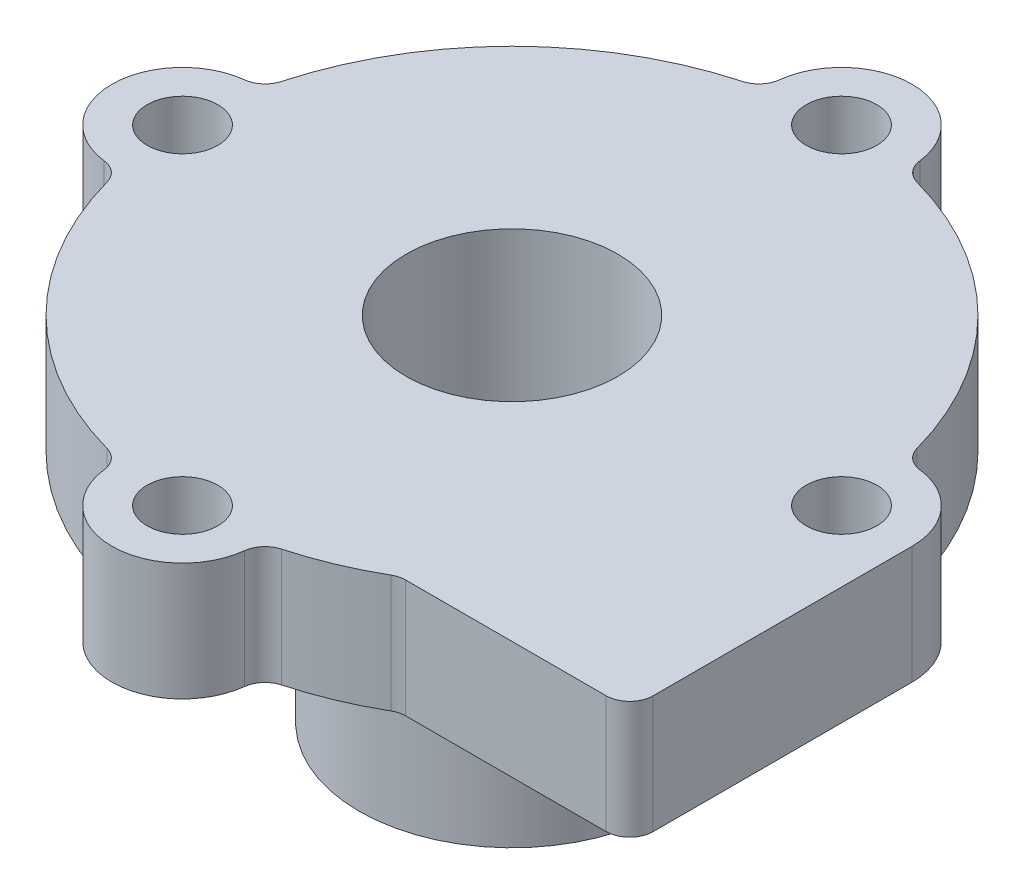
ISO-10303-21;
HEADER;
FILE_DESCRIPTION(('STEP AP214'),'2;1');
FILE_NAME('part.step','',(''),(''),'','','');
FILE_SCHEMA(('AUTOMOTIVE_DESIGN { 1 0 10303 214 1 1 1 1 }'));
ENDSEC;
DATA;
#1=APPLICATION_CONTEXT('core data for automotive mechanical design processes');
#2=APPLICATION_PROTOCOL_DEFINITION('international standard','automotive_design',2000,#1);
#3=PRODUCT_CONTEXT('',#1,'mechanical');
#4=PRODUCT('Part','Part','',(#3));
#5=PRODUCT_RELATED_PRODUCT_CATEGORY('part','',(#4));
#6=PRODUCT_DEFINITION_FORMATION('','',#4);
#7=PRODUCT_DEFINITION_CONTEXT('part definition',#1,'design');
#8=PRODUCT_DEFINITION('design','',#6,#7);
#9=PRODUCT_DEFINITION_SHAPE('','',#8);
#10=(LENGTH_UNIT() NAMED_UNIT(*) SI_UNIT(.MILLI.,.METRE.));
#11=(NAMED_UNIT(*) PLANE_ANGLE_UNIT() SI_UNIT($,.RADIAN.));
#12=(NAMED_UNIT(*) SI_UNIT($,.STERADIAN.) SOLID_ANGLE_UNIT());
#13=UNCERTAINTY_MEASURE_WITH_UNIT(LENGTH_MEASURE(1.E-05),#10,'distance_accuracy_value','');
#14=(GEOMETRIC_REPRESENTATION_CONTEXT(3) GLOBAL_UNCERTAINTY_ASSIGNED_CONTEXT((#13)) GLOBAL_UNIT_ASSIGNED_CONTEXT((#10,
#11,#12)) REPRESENTATION_CONTEXT('',''));
#15=CARTESIAN_POINT('',(0.,0.,0.));
#16=DIRECTION('',(0.,0.,1.));
#17=DIRECTION('',(1.,0.,0.));
#18=AXIS2_PLACEMENT_3D('',#15,#16,#17);
#19=CARTESIAN_POINT('',(0.,0.,0.));
#20=DIRECTION('',(0.,1.,0.));
#21=DIRECTION('',(0.,0.,1.));
#22=AXIS2_PLACEMENT_3D('',#19,#20,#21);
#23=PLANE('',#22);
#24=CARTESIAN_POINT('',(0.,0.,0.));
#25=DIRECTION('',(0.,1.,0.));
#26=DIRECTION('',(0.,0.,1.));
#27=AXIS2_PLACEMENT_3D('',#24,#25,#26);
#28=CIRCLE('',#27,7.5);
#29=CARTESIAN_POINT('',(0.,0.,7.5));
#30=VERTEX_POINT('',#29);
#31=EDGE_CURVE('E233',#30,#30,#28,.T.);
#32=ORIENTED_EDGE('',*,*,#31,.T.);
#33=EDGE_LOOP('',(#32));
#34=FACE_BOUND('',#33,.T.);
#35=CARTESIAN_POINT('',(0.,0.,-14.));
#36=DIRECTION('',(0.,1.,0.));
#37=DIRECTION('',(0.,0.,1.));
#38=AXIS2_PLACEMENT_3D('',#35,#36,#37);
#39=CIRCLE('',#38,1.5);
#40=CARTESIAN_POINT('',(0.,0.,-12.5));
#41=VERTEX_POINT('',#40);
#42=EDGE_CURVE('E203',#41,#41,#39,.T.);
#43=ORIENTED_EDGE('',*,*,#42,.T.);
#44=EDGE_LOOP('',(#43));
#45=FACE_BOUND('',#44,.T.);
#46=DIRECTION('',(0.,0.,-1.));
#47=VECTOR('',#46,1.);
#48=CARTESIAN_POINT('',(17.,0.,12.));
#49=LINE('',#48,#47);
#50=CARTESIAN_POINT('',(17.,0.,11.));
#51=VERTEX_POINT('',#50);
#52=CARTESIAN_POINT('',(17.,0.,0.));
#53=VERTEX_POINT('',#52);
#54=EDGE_CURVE('E163',#51,#53,#49,.T.);
#55=ORIENTED_EDGE('',*,*,#54,.F.);
#56=CARTESIAN_POINT('',(16.,0.,11.));
#57=DIRECTION('',(0.,1.,0.));
#58=DIRECTION('',(0.,0.,1.));
#59=AXIS2_PLACEMENT_3D('',#56,#57,#58);
#60=CIRCLE('',#59,1.);
#61=CARTESIAN_POINT('',(16.,0.,12.));
#62=VERTEX_POINT('',#61);
#63=EDGE_CURVE('E230',#51,#62,#60,.F.);
#64=ORIENTED_EDGE('',*,*,#63,.T.);
#65=DIRECTION('',(1.,0.,0.));
#66=VECTOR('',#65,1.);
#67=CARTESIAN_POINT('',(0.,0.,12.));
#68=LINE('',#67,#66);
#69=CARTESIAN_POINT('',(7.48331477354788,0.,12.));
#70=VERTEX_POINT('',#69);
#71=EDGE_CURVE('E172',#70,#62,#68,.T.);
#72=ORIENTED_EDGE('',*,*,#71,.F.);
#73=CARTESIAN_POINT('',(7.48331477354788,0.,13.));
#74=DIRECTION('',(0.,1.,0.));
#75=DIRECTION('',(0.,0.,1.));
#76=AXIS2_PLACEMENT_3D('',#73,#74,#75);
#77=CIRCLE('',#76,1.);
#78=CARTESIAN_POINT('',(6.98442712197802,0.,12.1333333333333));
#79=VERTEX_POINT('',#78);
#80=EDGE_CURVE('E11',#70,#79,#77,.T.);
#81=ORIENTED_EDGE('',*,*,#80,.T.);
#82=CARTESIAN_POINT('',(0.,0.,0.));
#83=DIRECTION('',(0.,1.,0.));
#84=DIRECTION('',(0.,0.,1.));
#85=AXIS2_PLACEMENT_3D('',#82,#83,#84);
#86=CIRCLE('',#85,14.);
#87=CARTESIAN_POINT('',(3.70809924354783,0.,13.5));
#88=VERTEX_POINT('',#87);
#89=EDGE_CURVE('E225',#88,#79,#86,.T.);
#90=ORIENTED_EDGE('',*,*,#89,.F.);
#91=CARTESIAN_POINT('',(3.97296347522982,0.,14.4642857142857));
#92=DIRECTION('',(0.,1.,0.));
#93=DIRECTION('',(0.,0.,1.));
#94=AXIS2_PLACEMENT_3D('',#91,#92,#93);
#95=CIRCLE('',#94,1.);
#96=CARTESIAN_POINT('',(2.97972260642237,0.,14.3482142857143));
#97=VERTEX_POINT('',#96);
#98=EDGE_CURVE('E304',#88,#97,#95,.T.);
#99=ORIENTED_EDGE('',*,*,#98,.T.);
#100=CARTESIAN_POINT('',(0.,0.,14.));
#101=DIRECTION('',(0.,1.,0.));
#102=DIRECTION('',(0.,0.,-1.));
#103=AXIS2_PLACEMENT_3D('',#100,#101,#102);
#104=CIRCLE('',#103,3.);
#105=CARTESIAN_POINT('',(-2.97972260642237,0.,14.3482142857143));
#106=VERTEX_POINT('',#105);
#107=EDGE_CURVE('E188',#106,#97,#104,.T.);
#108=ORIENTED_EDGE('',*,*,#107,.F.);
#109=CARTESIAN_POINT('',(-3.97296347522982,0.,14.4642857142857));
#110=DIRECTION('',(0.,1.,0.));
#111=DIRECTION('',(0.,0.,1.));
#112=AXIS2_PLACEMENT_3D('',#109,#110,#111);
#113=CIRCLE('',#112,1.);
#114=CARTESIAN_POINT('',(-3.70809924354783,0.,13.5));
#115=VERTEX_POINT('',#114);
#116=EDGE_CURVE('E298',#106,#115,#113,.T.);
#117=ORIENTED_EDGE('',*,*,#116,.T.);
#118=CARTESIAN_POINT('',(-13.5,0.,3.70809924354788));
#119=VERTEX_POINT('',#118);
#120=EDGE_CURVE('E328',#119,#115,#86,.T.);
#121=ORIENTED_EDGE('',*,*,#120,.F.);
#122=CARTESIAN_POINT('',(-14.4642857142857,0.,3.97296347522987));
#123=DIRECTION('',(0.,1.,0.));
#124=DIRECTION('',(0.,0.,1.));
#125=AXIS2_PLACEMENT_3D('',#122,#123,#124);
#126=CIRCLE('',#125,1.);
#127=CARTESIAN_POINT('',(-14.3482142857143,0.,2.97972260642242));
#128=VERTEX_POINT('',#127);
#129=EDGE_CURVE('E296',#119,#128,#126,.T.);
#130=ORIENTED_EDGE('',*,*,#129,.T.);
#131=CARTESIAN_POINT('',(-14.,0.,0.));
#132=DIRECTION('',(0.,1.,0.));
#133=DIRECTION('',(1.,0.,0.));
#134=AXIS2_PLACEMENT_3D('',#131,#132,#133);
#135=CIRCLE('',#134,3.);
#136=CARTESIAN_POINT('',(-14.3482142857143,0.,-2.97972260642231));
#137=VERTEX_POINT('',#136);
#138=EDGE_CURVE('E194',#137,#128,#135,.T.);
#139=ORIENTED_EDGE('',*,*,#138,.F.);
#140=CARTESIAN_POINT('',(-14.4642857142857,0.,-3.97296347522977));
#141=DIRECTION('',(0.,1.,0.));
#142=DIRECTION('',(0.,0.,1.));
#143=AXIS2_PLACEMENT_3D('',#140,#141,#142);
#144=CIRCLE('',#143,1.);
#145=CARTESIAN_POINT('',(-13.5,0.,-3.70809924354778));
#146=VERTEX_POINT('',#145);
#147=EDGE_CURVE('E290',#137,#146,#144,.T.);
#148=ORIENTED_EDGE('',*,*,#147,.T.);
#149=CARTESIAN_POINT('',(-3.70809924354783,0.,-13.5));
#150=VERTEX_POINT('',#149);
#151=EDGE_CURVE('E226',#150,#146,#86,.T.);
#152=ORIENTED_EDGE('',*,*,#151,.F.);
#153=CARTESIAN_POINT('',(-3.97296347522982,0.,-14.4642857142857));
#154=DIRECTION('',(0.,1.,0.));
#155=DIRECTION('',(0.,0.,1.));
#156=AXIS2_PLACEMENT_3D('',#153,#154,#155);
#157=CIRCLE('',#156,1.);
#158=CARTESIAN_POINT('',(-2.97972260642237,0.,-14.3482142857143));
#159=VERTEX_POINT('',#158);
#160=EDGE_CURVE('E288',#150,#159,#157,.T.);
#161=ORIENTED_EDGE('',*,*,#160,.T.);
#162=CARTESIAN_POINT('',(0.,0.,-14.));
#163=DIRECTION('',(0.,1.,0.));
#164=DIRECTION('',(0.,0.,1.));
#165=AXIS2_PLACEMENT_3D('',#162,#163,#164);
#166=CIRCLE('',#165,3.);
#167=CARTESIAN_POINT('',(2.97972260642237,0.,-14.3482142857143));
#168=VERTEX_POINT('',#167);
#169=EDGE_CURVE('E206',#168,#159,#166,.T.);
#170=ORIENTED_EDGE('',*,*,#169,.F.);
#171=CARTESIAN_POINT('',(3.97296347522982,0.,-14.4642857142857));
#172=DIRECTION('',(0.,1.,0.));
#173=DIRECTION('',(0.,0.,1.));
#174=AXIS2_PLACEMENT_3D('',#171,#172,#173);
#175=CIRCLE('',#174,1.);
#176=CARTESIAN_POINT('',(3.70809924354783,0.,-13.5));
#177=VERTEX_POINT('',#176);
#178=EDGE_CURVE('E282',#168,#177,#175,.T.);
#179=ORIENTED_EDGE('',*,*,#178,.T.);
#180=CARTESIAN_POINT('',(13.5,0.,-3.70809924354797));
#181=VERTEX_POINT('',#180);
#182=EDGE_CURVE('E217',#181,#177,#86,.T.);
#183=ORIENTED_EDGE('',*,*,#182,.F.);
#184=CARTESIAN_POINT('',(14.4642857142857,0.,-3.97296347522997));
#185=DIRECTION('',(0.,1.,0.));
#186=DIRECTION('',(0.,0.,1.));
#187=AXIS2_PLACEMENT_3D('',#184,#185,#186);
#188=CIRCLE('',#187,1.);
#189=CARTESIAN_POINT('',(14.3482142857143,0.,-2.97972260642252));
#190=VERTEX_POINT('',#189);
#191=EDGE_CURVE('E186',#181,#190,#188,.T.);
#192=ORIENTED_EDGE('',*,*,#191,.T.);
#193=CARTESIAN_POINT('',(14.,0.,-1.46642216231412E-13));
#194=DIRECTION('',(0.,1.,0.));
#195=DIRECTION('',(-1.,0.,0.));
#196=AXIS2_PLACEMENT_3D('',#193,#194,#195);
#197=CIRCLE('',#196,3.);
#198=EDGE_CURVE('E178',#53,#190,#197,.T.);
#199=ORIENTED_EDGE('',*,*,#198,.F.);
#200=EDGE_LOOP('',(#55,#64,#72,#81,#90,#99,#108,#117,#121,#130,#139,#148,#152,#161,#170,#179,
#183,#192,#199));
#201=FACE_BOUND('',#200,.T.);
#202=CARTESIAN_POINT('',(-14.,0.,0.));
#203=DIRECTION('',(0.,1.,0.));
#204=DIRECTION('',(1.,0.,0.));
#205=AXIS2_PLACEMENT_3D('',#202,#203,#204);
#206=CIRCLE('',#205,1.5);
#207=CARTESIAN_POINT('',(-12.5,0.,0.));
#208=VERTEX_POINT('',#207);
#209=EDGE_CURVE('E318',#208,#208,#206,.T.);
#210=ORIENTED_EDGE('',*,*,#209,.T.);
#211=EDGE_LOOP('',(#210));
#212=FACE_BOUND('',#211,.T.);
#213=CARTESIAN_POINT('',(0.,0.,14.));
#214=DIRECTION('',(0.,1.,0.));
#215=DIRECTION('',(0.,0.,-1.));
#216=AXIS2_PLACEMENT_3D('',#213,#214,#215);
#217=CIRCLE('',#216,1.5);
#218=CARTESIAN_POINT('',(0.,0.,12.5));
#219=VERTEX_POINT('',#218);
#220=EDGE_CURVE('E429',#219,#219,#217,.T.);
#221=ORIENTED_EDGE('',*,*,#220,.T.);
#222=EDGE_LOOP('',(#221));
#223=FACE_BOUND('',#222,.T.);
#224=CARTESIAN_POINT('',(14.,0.,-1.46642216231412E-13));
#225=DIRECTION('',(0.,1.,0.));
#226=DIRECTION('',(-1.,0.,0.));
#227=AXIS2_PLACEMENT_3D('',#224,#225,#226);
#228=CIRCLE('',#227,1.5);
#229=CARTESIAN_POINT('',(12.5,0.,-1.30930550206618E-13));
#230=VERTEX_POINT('',#229);
#231=EDGE_CURVE('E435',#230,#230,#228,.T.);
#232=ORIENTED_EDGE('',*,*,#231,.T.);
#233=EDGE_LOOP('',(#232));
#234=FACE_BOUND('',#233,.T.);
#235=ADVANCED_FACE('F33',(#34,#45,#201,#212,#223,#234),#23,.F.);
#236=CARTESIAN_POINT('',(0.,5.,0.));
#237=DIRECTION('',(0.,-1.,0.));
#238=DIRECTION('',(0.,0.,-1.));
#239=AXIS2_PLACEMENT_3D('',#236,#237,#238);
#240=CYLINDRICAL_SURFACE('',#239,14.);
#241=CARTESIAN_POINT('',(0.,5.,0.));
#242=DIRECTION('',(0.,1.,0.));
#243=DIRECTION('',(0.,0.,1.));
#244=AXIS2_PLACEMENT_3D('',#241,#242,#243);
#245=CIRCLE('',#244,14.);
#246=CARTESIAN_POINT('',(3.70809924354783,5.,13.5));
#247=VERTEX_POINT('',#246);
#248=CARTESIAN_POINT('',(6.98442712197802,5.,12.1333333333333));
#249=VERTEX_POINT('',#248);
#250=EDGE_CURVE('E218',#247,#249,#245,.T.);
#251=ORIENTED_EDGE('',*,*,#250,.F.);
#252=DIRECTION('',(0.,-1.,0.));
#253=VECTOR('',#252,1.);
#254=CARTESIAN_POINT('',(3.70809924354783,5.,13.5));
#255=LINE('',#254,#253);
#256=EDGE_CURVE('E271',#247,#88,#255,.T.);
#257=ORIENTED_EDGE('',*,*,#256,.T.);
#258=ORIENTED_EDGE('',*,*,#89,.T.);
#259=DIRECTION('',(0.,-1.,0.));
#260=VECTOR('',#259,1.);
#261=CARTESIAN_POINT('',(6.98442712197802,5.,12.1333333333333));
#262=LINE('',#261,#260);
#263=EDGE_CURVE('E268',#79,#249,#262,.F.);
#264=ORIENTED_EDGE('',*,*,#263,.T.);
#265=EDGE_LOOP('',(#251,#257,#258,#264));
#266=FACE_BOUND('',#265,.T.);
#267=ADVANCED_FACE('F326',(#266),#240,.T.);
#268=CARTESIAN_POINT('',(13.5,5.,-3.70809924354797));
#269=VERTEX_POINT('',#268);
#270=CARTESIAN_POINT('',(3.70809924354783,5.,-13.5));
#271=VERTEX_POINT('',#270);
#272=EDGE_CURVE('E222',#269,#271,#245,.T.);
#273=ORIENTED_EDGE('',*,*,#272,.F.);
#274=DIRECTION('',(0.,-1.,0.));
#275=VECTOR('',#274,1.);
#276=CARTESIAN_POINT('',(13.5,5.,-3.70809924354797));
#277=LINE('',#276,#275);
#278=EDGE_CURVE('E240',#269,#181,#277,.T.);
#279=ORIENTED_EDGE('',*,*,#278,.T.);
#280=ORIENTED_EDGE('',*,*,#182,.T.);
#281=DIRECTION('',(0.,-1.,0.));
#282=VECTOR('',#281,1.);
#283=CARTESIAN_POINT('',(3.70809924354783,5.,-13.5));
#284=LINE('',#283,#282);
#285=EDGE_CURVE('E238',#177,#271,#284,.F.);
#286=ORIENTED_EDGE('',*,*,#285,.T.);
#287=EDGE_LOOP('',(#273,#279,#280,#286));
#288=FACE_BOUND('',#287,.T.);
#289=ADVANCED_FACE('F371',(#288),#240,.T.);
#290=CARTESIAN_POINT('',(-13.5,5.,3.70809924354788));
#291=VERTEX_POINT('',#290);
#292=CARTESIAN_POINT('',(-3.70809924354783,5.,13.5));
#293=VERTEX_POINT('',#292);
#294=EDGE_CURVE('E221',#291,#293,#245,.T.);
#295=ORIENTED_EDGE('',*,*,#294,.F.);
#296=DIRECTION('',(0.,-1.,0.));
#297=VECTOR('',#296,1.);
#298=CARTESIAN_POINT('',(-13.5,5.,3.70809924354788));
#299=LINE('',#298,#297);
#300=EDGE_CURVE('E260',#291,#119,#299,.T.);
#301=ORIENTED_EDGE('',*,*,#300,.T.);
#302=ORIENTED_EDGE('',*,*,#120,.T.);
#303=DIRECTION('',(0.,-1.,0.));
#304=VECTOR('',#303,1.);
#305=CARTESIAN_POINT('',(-3.70809924354783,5.,13.5));
#306=LINE('',#305,#304);
#307=EDGE_CURVE('E258',#115,#293,#306,.F.);
#308=ORIENTED_EDGE('',*,*,#307,.T.);
#309=EDGE_LOOP('',(#295,#301,#302,#308));
#310=FACE_BOUND('',#309,.T.);
#311=ADVANCED_FACE('F379',(#310),#240,.T.);
#312=CARTESIAN_POINT('',(-3.70809924354783,5.,-13.5));
#313=VERTEX_POINT('',#312);
#314=CARTESIAN_POINT('',(-13.5,5.,-3.70809924354778));
#315=VERTEX_POINT('',#314);
#316=EDGE_CURVE('E231',#313,#315,#245,.T.);
#317=ORIENTED_EDGE('',*,*,#316,.F.);
#318=DIRECTION('',(0.,-1.,0.));
#319=VECTOR('',#318,1.);
#320=CARTESIAN_POINT('',(-3.70809924354783,5.,-13.5));
#321=LINE('',#320,#319);
#322=EDGE_CURVE('E250',#313,#150,#321,.T.);
#323=ORIENTED_EDGE('',*,*,#322,.T.);
#324=ORIENTED_EDGE('',*,*,#151,.T.);
#325=DIRECTION('',(0.,-1.,0.));
#326=VECTOR('',#325,1.);
#327=CARTESIAN_POINT('',(-13.5,5.,-3.70809924354778));
#328=LINE('',#327,#326);
#329=EDGE_CURVE('E248',#146,#315,#328,.F.);
#330=ORIENTED_EDGE('',*,*,#329,.T.);
#331=EDGE_LOOP('',(#317,#323,#324,#330));
#332=FACE_BOUND('',#331,.T.);
#333=ADVANCED_FACE('F373',(#332),#240,.T.);
#334=CARTESIAN_POINT('',(0.,5.,0.));
#335=DIRECTION('',(0.,1.,0.));
#336=DIRECTION('',(0.,0.,1.));
#337=AXIS2_PLACEMENT_3D('',#334,#335,#336);
#338=PLANE('',#337);
#339=CARTESIAN_POINT('',(14.,5.,-1.46642216231412E-13));
#340=DIRECTION('',(0.,1.,0.));
#341=DIRECTION('',(-1.,0.,0.));
#342=AXIS2_PLACEMENT_3D('',#339,#340,#341);
#343=CIRCLE('',#342,1.5);
#344=CARTESIAN_POINT('',(12.5,5.,-1.30930550206618E-13));
#345=VERTEX_POINT('',#344);
#346=EDGE_CURVE('E438',#345,#345,#343,.T.);
#347=ORIENTED_EDGE('',*,*,#346,.F.);
#348=EDGE_LOOP('',(#347));
#349=FACE_BOUND('',#348,.T.);
#350=CARTESIAN_POINT('',(0.,5.,14.));
#351=DIRECTION('',(0.,1.,0.));
#352=DIRECTION('',(0.,0.,-1.));
#353=AXIS2_PLACEMENT_3D('',#350,#351,#352);
#354=CIRCLE('',#353,1.5);
#355=CARTESIAN_POINT('',(0.,5.,12.5));
#356=VERTEX_POINT('',#355);
#357=EDGE_CURVE('E432',#356,#356,#354,.T.);
#358=ORIENTED_EDGE('',*,*,#357,.F.);
#359=EDGE_LOOP('',(#358));
#360=FACE_BOUND('',#359,.T.);
#361=CARTESIAN_POINT('',(-14.,5.,0.));
#362=DIRECTION('',(0.,1.,0.));
#363=DIRECTION('',(1.,0.,0.));
#364=AXIS2_PLACEMENT_3D('',#361,#362,#363);
#365=CIRCLE('',#364,1.5);
#366=CARTESIAN_POINT('',(-12.5,5.,0.));
#367=VERTEX_POINT('',#366);
#368=EDGE_CURVE('E426',#367,#367,#365,.T.);
#369=ORIENTED_EDGE('',*,*,#368,.F.);
#370=EDGE_LOOP('',(#369));
#371=FACE_BOUND('',#370,.T.);
#372=DIRECTION('',(1.,0.,0.));
#373=VECTOR('',#372,1.);
#374=CARTESIAN_POINT('',(0.,5.,12.));
#375=LINE('',#374,#373);
#376=CARTESIAN_POINT('',(7.48331477354788,5.,12.));
#377=VERTEX_POINT('',#376);
#378=CARTESIAN_POINT('',(16.,5.,12.));
#379=VERTEX_POINT('',#378);
#380=EDGE_CURVE('E308',#377,#379,#375,.T.);
#381=ORIENTED_EDGE('',*,*,#380,.T.);
#382=CARTESIAN_POINT('',(16.,5.,11.));
#383=DIRECTION('',(0.,1.,0.));
#384=DIRECTION('',(0.,0.,1.));
#385=AXIS2_PLACEMENT_3D('',#382,#383,#384);
#386=CIRCLE('',#385,1.);
#387=CARTESIAN_POINT('',(17.,5.,11.));
#388=VERTEX_POINT('',#387);
#389=EDGE_CURVE('E48',#379,#388,#386,.T.);
#390=ORIENTED_EDGE('',*,*,#389,.T.);
#391=DIRECTION('',(0.,0.,-1.));
#392=VECTOR('',#391,1.);
#393=CARTESIAN_POINT('',(17.,5.,12.));
#394=LINE('',#393,#392);
#395=CARTESIAN_POINT('',(17.,5.,0.));
#396=VERTEX_POINT('',#395);
#397=EDGE_CURVE('E317',#388,#396,#394,.T.);
#398=ORIENTED_EDGE('',*,*,#397,.T.);
#399=CARTESIAN_POINT('',(14.,5.,-1.46642216231412E-13));
#400=DIRECTION('',(0.,1.,0.));
#401=DIRECTION('',(-1.,0.,0.));
#402=AXIS2_PLACEMENT_3D('',#399,#400,#401);
#403=CIRCLE('',#402,3.);
#404=CARTESIAN_POINT('',(14.3482142857143,5.,-2.97972260642252));
#405=VERTEX_POINT('',#404);
#406=EDGE_CURVE('E181',#396,#405,#403,.T.);
#407=ORIENTED_EDGE('',*,*,#406,.T.);
#408=CARTESIAN_POINT('',(14.4642857142857,5.,-3.97296347522997));
#409=DIRECTION('',(0.,1.,0.));
#410=DIRECTION('',(0.,0.,1.));
#411=AXIS2_PLACEMENT_3D('',#408,#409,#410);
#412=CIRCLE('',#411,1.);
#413=EDGE_CURVE('E279',#405,#269,#412,.F.);
#414=ORIENTED_EDGE('',*,*,#413,.T.);
#415=ORIENTED_EDGE('',*,*,#272,.T.);
#416=CARTESIAN_POINT('',(3.97296347522982,5.,-14.4642857142857));
#417=DIRECTION('',(0.,1.,0.));
#418=DIRECTION('',(0.,0.,1.));
#419=AXIS2_PLACEMENT_3D('',#416,#417,#418);
#420=CIRCLE('',#419,1.);
#421=CARTESIAN_POINT('',(2.97972260642237,5.,-14.3482142857143));
#422=VERTEX_POINT('',#421);
#423=EDGE_CURVE('E284',#271,#422,#420,.F.);
#424=ORIENTED_EDGE('',*,*,#423,.T.);
#425=CARTESIAN_POINT('',(0.,5.,-14.));
#426=DIRECTION('',(0.,1.,0.));
#427=DIRECTION('',(0.,0.,1.));
#428=AXIS2_PLACEMENT_3D('',#425,#426,#427);
#429=CIRCLE('',#428,3.);
#430=CARTESIAN_POINT('',(-2.97972260642237,5.,-14.3482142857143));
#431=VERTEX_POINT('',#430);
#432=EDGE_CURVE('E209',#422,#431,#429,.T.);
#433=ORIENTED_EDGE('',*,*,#432,.T.);
#434=CARTESIAN_POINT('',(-3.97296347522982,5.,-14.4642857142857));
#435=DIRECTION('',(0.,1.,0.));
#436=DIRECTION('',(0.,0.,1.));
#437=AXIS2_PLACEMENT_3D('',#434,#435,#436);
#438=CIRCLE('',#437,1.);
#439=EDGE_CURVE('E286',#431,#313,#438,.F.);
#440=ORIENTED_EDGE('',*,*,#439,.T.);
#441=ORIENTED_EDGE('',*,*,#316,.T.);
#442=CARTESIAN_POINT('',(-14.4642857142857,5.,-3.97296347522977));
#443=DIRECTION('',(0.,1.,0.));
#444=DIRECTION('',(0.,0.,1.));
#445=AXIS2_PLACEMENT_3D('',#442,#443,#444);
#446=CIRCLE('',#445,1.);
#447=CARTESIAN_POINT('',(-14.3482142857143,5.,-2.97972260642231));
#448=VERTEX_POINT('',#447);
#449=EDGE_CURVE('E292',#315,#448,#446,.F.);
#450=ORIENTED_EDGE('',*,*,#449,.T.);
#451=CARTESIAN_POINT('',(-14.,5.,0.));
#452=DIRECTION('',(0.,1.,0.));
#453=DIRECTION('',(1.,0.,0.));
#454=AXIS2_PLACEMENT_3D('',#451,#452,#453);
#455=CIRCLE('',#454,3.);
#456=CARTESIAN_POINT('',(-14.3482142857143,5.,2.97972260642242));
#457=VERTEX_POINT('',#456);
#458=EDGE_CURVE('E197',#448,#457,#455,.T.);
#459=ORIENTED_EDGE('',*,*,#458,.T.);
#460=CARTESIAN_POINT('',(-14.4642857142857,5.,3.97296347522987));
#461=DIRECTION('',(0.,1.,0.));
#462=DIRECTION('',(0.,0.,1.));
#463=AXIS2_PLACEMENT_3D('',#460,#461,#462);
#464=CIRCLE('',#463,1.);
#465=EDGE_CURVE('E294',#457,#291,#464,.F.);
#466=ORIENTED_EDGE('',*,*,#465,.T.);
#467=ORIENTED_EDGE('',*,*,#294,.T.);
#468=CARTESIAN_POINT('',(-3.97296347522982,5.,14.4642857142857));
#469=DIRECTION('',(0.,1.,0.));
#470=DIRECTION('',(0.,0.,1.));
#471=AXIS2_PLACEMENT_3D('',#468,#469,#470);
#472=CIRCLE('',#471,1.);
#473=CARTESIAN_POINT('',(-2.97972260642237,5.,14.3482142857143));
#474=VERTEX_POINT('',#473);
#475=EDGE_CURVE('E300',#293,#474,#472,.F.);
#476=ORIENTED_EDGE('',*,*,#475,.T.);
#477=CARTESIAN_POINT('',(0.,5.,14.));
#478=DIRECTION('',(0.,1.,0.));
#479=DIRECTION('',(0.,0.,-1.));
#480=AXIS2_PLACEMENT_3D('',#477,#478,#479);
#481=CIRCLE('',#480,3.);
#482=CARTESIAN_POINT('',(2.97972260642237,5.,14.3482142857143));
#483=VERTEX_POINT('',#482);
#484=EDGE_CURVE('E191',#474,#483,#481,.T.);
#485=ORIENTED_EDGE('',*,*,#484,.T.);
#486=CARTESIAN_POINT('',(3.97296347522982,5.,14.4642857142857));
#487=DIRECTION('',(0.,1.,0.));
#488=DIRECTION('',(0.,0.,1.));
#489=AXIS2_PLACEMENT_3D('',#486,#487,#488);
#490=CIRCLE('',#489,1.);
#491=EDGE_CURVE('E302',#483,#247,#490,.F.);
#492=ORIENTED_EDGE('',*,*,#491,.T.);
#493=ORIENTED_EDGE('',*,*,#250,.T.);
#494=CARTESIAN_POINT('',(7.48331477354788,5.,13.));
#495=DIRECTION('',(0.,1.,0.));
#496=DIRECTION('',(0.,0.,1.));
#497=AXIS2_PLACEMENT_3D('',#494,#495,#496);
#498=CIRCLE('',#497,1.);
#499=EDGE_CURVE('E41',#249,#377,#498,.F.);
#500=ORIENTED_EDGE('',*,*,#499,.T.);
#501=EDGE_LOOP('',(#381,#390,#398,#407,#414,#415,#424,#433,#440,#441,#450,#459,#466,#467,#476,
#485,#492,#493,#500));
#502=FACE_BOUND('',#501,.T.);
#503=CARTESIAN_POINT('',(0.,5.,-14.));
#504=DIRECTION('',(0.,1.,0.));
#505=DIRECTION('',(0.,0.,1.));
#506=AXIS2_PLACEMENT_3D('',#503,#504,#505);
#507=CIRCLE('',#506,1.5);
#508=CARTESIAN_POINT('',(0.,5.,-12.5));
#509=VERTEX_POINT('',#508);
#510=EDGE_CURVE('E200',#509,#509,#507,.T.);
#511=ORIENTED_EDGE('',*,*,#510,.F.);
#512=EDGE_LOOP('',(#511));
#513=FACE_BOUND('',#512,.T.);
#514=CARTESIAN_POINT('',(0.,5.,0.));
#515=DIRECTION('',(0.,1.,0.));
#516=DIRECTION('',(0.,0.,1.));
#517=AXIS2_PLACEMENT_3D('',#514,#515,#516);
#518=CIRCLE('',#517,4.5);
#519=CARTESIAN_POINT('',(0.,5.,4.5));
#520=VERTEX_POINT('',#519);
#521=EDGE_CURVE('E212',#520,#520,#518,.T.);
#522=ORIENTED_EDGE('',*,*,#521,.F.);
#523=EDGE_LOOP('',(#522));
#524=FACE_BOUND('',#523,.T.);
#525=ADVANCED_FACE('F306',(#349,#360,#371,#502,#513,#524),#338,.T.);
#526=CARTESIAN_POINT('',(0.,5.,0.));
#527=DIRECTION('',(0.,-1.,0.));
#528=DIRECTION('',(0.,0.,-1.));
#529=AXIS2_PLACEMENT_3D('',#526,#527,#528);
#530=CYLINDRICAL_SURFACE('',#529,4.5);
#531=ORIENTED_EDGE('',*,*,#521,.T.);
#532=EDGE_LOOP('',(#531));
#533=FACE_BOUND('',#532,.T.);
#534=CARTESIAN_POINT('',(0.,-10.,0.));
#535=DIRECTION('',(0.,-1.,0.));
#536=DIRECTION('',(0.,0.,-1.));
#537=AXIS2_PLACEMENT_3D('',#534,#535,#536);
#538=CIRCLE('',#537,4.5);
#539=CARTESIAN_POINT('',(0.,-10.,-4.5));
#540=VERTEX_POINT('',#539);
#541=EDGE_CURVE('E446',#540,#540,#538,.T.);
#542=ORIENTED_EDGE('',*,*,#541,.T.);
#543=EDGE_LOOP('',(#542));
#544=FACE_BOUND('',#543,.T.);
#545=ADVANCED_FACE('F450',(#533,#544),#530,.F.);
#546=CARTESIAN_POINT('',(0.,5.,-14.));
#547=DIRECTION('',(0.,-1.,0.));
#548=DIRECTION('',(0.,0.,-1.));
#549=AXIS2_PLACEMENT_3D('',#546,#547,#548);
#550=CYLINDRICAL_SURFACE('',#549,3.);
#551=ORIENTED_EDGE('',*,*,#432,.F.);
#552=DIRECTION('',(0.,-1.,0.));
#553=VECTOR('',#552,1.);
#554=CARTESIAN_POINT('',(2.97972260642237,5.,-14.3482142857143));
#555=LINE('',#554,#553);
#556=EDGE_CURVE('E245',#422,#168,#555,.T.);
#557=ORIENTED_EDGE('',*,*,#556,.T.);
#558=ORIENTED_EDGE('',*,*,#169,.T.);
#559=DIRECTION('',(0.,-1.,0.));
#560=VECTOR('',#559,1.);
#561=CARTESIAN_POINT('',(-2.97972260642237,5.,-14.3482142857143));
#562=LINE('',#561,#560);
#563=EDGE_CURVE('E242',#159,#431,#562,.F.);
#564=ORIENTED_EDGE('',*,*,#563,.T.);
#565=EDGE_LOOP('',(#551,#557,#558,#564));
#566=FACE_BOUND('',#565,.T.);
#567=ADVANCED_FACE('F418',(#566),#550,.T.);
#568=CARTESIAN_POINT('',(0.,0.,-14.));
#569=DIRECTION('',(0.,1.,0.));
#570=DIRECTION('',(0.,0.,1.));
#571=AXIS2_PLACEMENT_3D('',#568,#569,#570);
#572=CYLINDRICAL_SURFACE('',#571,1.5);
#573=ORIENTED_EDGE('',*,*,#42,.F.);
#574=EDGE_LOOP('',(#573));
#575=FACE_BOUND('',#574,.T.);
#576=ORIENTED_EDGE('',*,*,#510,.T.);
#577=EDGE_LOOP('',(#576));
#578=FACE_BOUND('',#577,.T.);
#579=ADVANCED_FACE('F484',(#575,#578),#572,.F.);
#580=CARTESIAN_POINT('',(-14.,5.,0.));
#581=DIRECTION('',(0.,-1.,0.));
#582=DIRECTION('',(0.,0.,-1.));
#583=AXIS2_PLACEMENT_3D('',#580,#581,#582);
#584=CYLINDRICAL_SURFACE('',#583,3.);
#585=ORIENTED_EDGE('',*,*,#458,.F.);
#586=DIRECTION('',(0.,-1.,0.));
#587=VECTOR('',#586,1.);
#588=CARTESIAN_POINT('',(-14.3482142857143,5.,-2.97972260642232));
#589=LINE('',#588,#587);
#590=EDGE_CURVE('E255',#448,#137,#589,.T.);
#591=ORIENTED_EDGE('',*,*,#590,.T.);
#592=ORIENTED_EDGE('',*,*,#138,.T.);
#593=DIRECTION('',(0.,-1.,0.));
#594=VECTOR('',#593,1.);
#595=CARTESIAN_POINT('',(-14.3482142857143,5.,2.97972260642242));
#596=LINE('',#595,#594);
#597=EDGE_CURVE('E252',#128,#457,#596,.F.);
#598=ORIENTED_EDGE('',*,*,#597,.T.);
#599=EDGE_LOOP('',(#585,#591,#592,#598));
#600=FACE_BOUND('',#599,.T.);
#601=ADVANCED_FACE('F410',(#600),#584,.T.);
#602=CARTESIAN_POINT('',(0.,5.,14.));
#603=DIRECTION('',(0.,-1.,0.));
#604=DIRECTION('',(0.,0.,-1.));
#605=AXIS2_PLACEMENT_3D('',#602,#603,#604);
#606=CYLINDRICAL_SURFACE('',#605,3.);
#607=ORIENTED_EDGE('',*,*,#484,.F.);
#608=DIRECTION('',(0.,-1.,0.));
#609=VECTOR('',#608,1.);
#610=CARTESIAN_POINT('',(-2.97972260642237,5.,14.3482142857143));
#611=LINE('',#610,#609);
#612=EDGE_CURVE('E265',#474,#106,#611,.T.);
#613=ORIENTED_EDGE('',*,*,#612,.T.);
#614=ORIENTED_EDGE('',*,*,#107,.T.);
#615=DIRECTION('',(0.,-1.,0.));
#616=VECTOR('',#615,1.);
#617=CARTESIAN_POINT('',(2.97972260642237,5.,14.3482142857143));
#618=LINE('',#617,#616);
#619=EDGE_CURVE('E262',#97,#483,#618,.F.);
#620=ORIENTED_EDGE('',*,*,#619,.T.);
#621=EDGE_LOOP('',(#607,#613,#614,#620));
#622=FACE_BOUND('',#621,.T.);
#623=ADVANCED_FACE('F353',(#622),#606,.T.);
#624=CARTESIAN_POINT('',(14.,5.,-1.46642216231412E-13));
#625=DIRECTION('',(0.,-1.,0.));
#626=DIRECTION('',(0.,0.,-1.));
#627=AXIS2_PLACEMENT_3D('',#624,#625,#626);
#628=CYLINDRICAL_SURFACE('',#627,3.);
#629=ORIENTED_EDGE('',*,*,#198,.T.);
#630=DIRECTION('',(0.,-1.,0.));
#631=VECTOR('',#630,1.);
#632=CARTESIAN_POINT('',(14.3482142857143,5.,-2.97972260642252));
#633=LINE('',#632,#631);
#634=EDGE_CURVE('E236',#190,#405,#633,.F.);
#635=ORIENTED_EDGE('',*,*,#634,.T.);
#636=ORIENTED_EDGE('',*,*,#406,.F.);
#637=DIRECTION('',(0.,1.,0.));
#638=VECTOR('',#637,1.);
#639=CARTESIAN_POINT('',(17.,0.,0.));
#640=LINE('',#639,#638);
#641=EDGE_CURVE('E166',#53,#396,#640,.T.);
#642=ORIENTED_EDGE('',*,*,#641,.F.);
#643=EDGE_LOOP('',(#629,#635,#636,#642));
#644=FACE_BOUND('',#643,.T.);
#645=ADVANCED_FACE('F176',(#644),#628,.T.);
#646=CARTESIAN_POINT('',(0.,0.,12.));
#647=DIRECTION('',(0.,0.,1.));
#648=DIRECTION('',(1.,0.,0.));
#649=AXIS2_PLACEMENT_3D('',#646,#647,#648);
#650=PLANE('',#649);
#651=ORIENTED_EDGE('',*,*,#380,.F.);
#652=DIRECTION('',(0.,-1.,0.));
#653=VECTOR('',#652,1.);
#654=CARTESIAN_POINT('',(7.48331477354788,0.,12.));
#655=LINE('',#654,#653);
#656=EDGE_CURVE('E275',#377,#70,#655,.T.);
#657=ORIENTED_EDGE('',*,*,#656,.T.);
#658=ORIENTED_EDGE('',*,*,#71,.T.);
#659=DIRECTION('',(0.,1.,0.));
#660=VECTOR('',#659,1.);
#661=CARTESIAN_POINT('',(16.,0.,12.));
#662=LINE('',#661,#660);
#663=EDGE_CURVE('E273',#62,#379,#662,.T.);
#664=ORIENTED_EDGE('',*,*,#663,.T.);
#665=EDGE_LOOP('',(#651,#657,#658,#664));
#666=FACE_BOUND('',#665,.T.);
#667=ADVANCED_FACE('F314',(#666),#650,.T.);
#668=CARTESIAN_POINT('',(17.,0.,12.));
#669=DIRECTION('',(1.,0.,0.));
#670=DIRECTION('',(0.,0.,-1.));
#671=AXIS2_PLACEMENT_3D('',#668,#669,#670);
#672=PLANE('',#671);
#673=ORIENTED_EDGE('',*,*,#397,.F.);
#674=DIRECTION('',(0.,1.,0.));
#675=VECTOR('',#674,1.);
#676=CARTESIAN_POINT('',(17.,0.,11.));
#677=LINE('',#676,#675);
#678=EDGE_CURVE('E168',#388,#51,#677,.F.);
#679=ORIENTED_EDGE('',*,*,#678,.T.);
#680=ORIENTED_EDGE('',*,*,#54,.T.);
#681=ORIENTED_EDGE('',*,*,#641,.T.);
#682=EDGE_LOOP('',(#673,#679,#680,#681));
#683=FACE_BOUND('',#682,.T.);
#684=ADVANCED_FACE('F165',(#683),#672,.T.);
#685=CARTESIAN_POINT('',(-14.,0.,0.));
#686=DIRECTION('',(0.,1.,0.));
#687=DIRECTION('',(0.,0.,1.));
#688=AXIS2_PLACEMENT_3D('',#685,#686,#687);
#689=CYLINDRICAL_SURFACE('',#688,1.5);
#690=ORIENTED_EDGE('',*,*,#209,.F.);
#691=EDGE_LOOP('',(#690));
#692=FACE_BOUND('',#691,.T.);
#693=ORIENTED_EDGE('',*,*,#368,.T.);
#694=EDGE_LOOP('',(#693));
#695=FACE_BOUND('',#694,.T.);
#696=ADVANCED_FACE('F469',(#692,#695),#689,.F.);
#697=CARTESIAN_POINT('',(0.,0.,14.));
#698=DIRECTION('',(0.,1.,0.));
#699=DIRECTION('',(0.,0.,1.));
#700=AXIS2_PLACEMENT_3D('',#697,#698,#699);
#701=CYLINDRICAL_SURFACE('',#700,1.5);
#702=ORIENTED_EDGE('',*,*,#220,.F.);
#703=EDGE_LOOP('',(#702));
#704=FACE_BOUND('',#703,.T.);
#705=ORIENTED_EDGE('',*,*,#357,.T.);
#706=EDGE_LOOP('',(#705));
#707=FACE_BOUND('',#706,.T.);
#708=ADVANCED_FACE('F463',(#704,#707),#701,.F.);
#709=CARTESIAN_POINT('',(14.,0.,-1.46642216231412E-13));
#710=DIRECTION('',(0.,1.,0.));
#711=DIRECTION('',(0.,0.,1.));
#712=AXIS2_PLACEMENT_3D('',#709,#710,#711);
#713=CYLINDRICAL_SURFACE('',#712,1.5);
#714=ORIENTED_EDGE('',*,*,#231,.F.);
#715=EDGE_LOOP('',(#714));
#716=FACE_BOUND('',#715,.T.);
#717=ORIENTED_EDGE('',*,*,#346,.T.);
#718=EDGE_LOOP('',(#717));
#719=FACE_BOUND('',#718,.T.);
#720=ADVANCED_FACE('F454',(#716,#719),#713,.F.);
#721=CARTESIAN_POINT('',(0.,-10.,0.));
#722=DIRECTION('',(0.,-1.,0.));
#723=DIRECTION('',(0.,0.,-1.));
#724=AXIS2_PLACEMENT_3D('',#721,#722,#723);
#725=PLANE('',#724);
#726=CARTESIAN_POINT('',(0.,-10.,0.));
#727=DIRECTION('',(0.,-1.,0.));
#728=DIRECTION('',(0.,0.,-1.));
#729=AXIS2_PLACEMENT_3D('',#726,#727,#728);
#730=CIRCLE('',#729,6.5);
#731=CARTESIAN_POINT('',(0.,-10.,-6.5));
#732=VERTEX_POINT('',#731);
#733=EDGE_CURVE('E441',#732,#732,#730,.T.);
#734=ORIENTED_EDGE('',*,*,#733,.T.);
#735=EDGE_LOOP('',(#734));
#736=FACE_BOUND('',#735,.T.);
#737=ORIENTED_EDGE('',*,*,#541,.F.);
#738=EDGE_LOOP('',(#737));
#739=FACE_BOUND('',#738,.T.);
#740=ADVANCED_FACE('F452',(#736,#739),#725,.T.);
#741=CARTESIAN_POINT('',(0.,-10.,0.));
#742=DIRECTION('',(0.,1.,0.));
#743=DIRECTION('',(0.,0.,1.));
#744=AXIS2_PLACEMENT_3D('',#741,#742,#743);
#745=CYLINDRICAL_SURFACE('',#744,6.5);
#746=CARTESIAN_POINT('',(0.,-0.999999999999999,0.));
#747=DIRECTION('',(0.,1.,0.));
#748=DIRECTION('',(0.,0.,1.));
#749=AXIS2_PLACEMENT_3D('',#746,#747,#748);
#750=CIRCLE('',#749,6.5);
#751=CARTESIAN_POINT('',(0.,-0.999999999999999,6.5));
#752=VERTEX_POINT('',#751);
#753=EDGE_CURVE('E227',#752,#752,#750,.F.);
#754=ORIENTED_EDGE('',*,*,#753,.T.);
#755=EDGE_LOOP('',(#754));
#756=FACE_BOUND('',#755,.T.);
#757=ORIENTED_EDGE('',*,*,#733,.F.);
#758=EDGE_LOOP('',(#757));
#759=FACE_BOUND('',#758,.T.);
#760=ADVANCED_FACE('F384',(#756,#759),#745,.T.);
#761=CARTESIAN_POINT('',(0.,-0.999999999999999,0.));
#762=DIRECTION('',(0.,1.,0.));
#763=DIRECTION('',(0.,0.,1.));
#764=AXIS2_PLACEMENT_3D('',#761,#762,#763);
#765=TOROIDAL_SURFACE('',#764,7.5,1.);
#766=ORIENTED_EDGE('',*,*,#31,.F.);
#767=EDGE_LOOP('',(#766));
#768=FACE_BOUND('',#767,.T.);
#769=ORIENTED_EDGE('',*,*,#753,.F.);
#770=EDGE_LOOP('',(#769));
#771=FACE_BOUND('',#770,.T.);
#772=ADVANCED_FACE('F380',(#768,#771),#765,.F.);
#773=CARTESIAN_POINT('',(14.4642857142857,5.,-3.97296347522997));
#774=DIRECTION('',(0.,-1.,0.));
#775=DIRECTION('',(0.,0.,-1.));
#776=AXIS2_PLACEMENT_3D('',#773,#774,#775);
#777=CYLINDRICAL_SURFACE('',#776,1.);
#778=ORIENTED_EDGE('',*,*,#191,.F.);
#779=ORIENTED_EDGE('',*,*,#278,.F.);
#780=ORIENTED_EDGE('',*,*,#413,.F.);
#781=ORIENTED_EDGE('',*,*,#634,.F.);
#782=EDGE_LOOP('',(#778,#779,#780,#781));
#783=FACE_BOUND('',#782,.T.);
#784=ADVANCED_FACE('F383',(#783),#777,.F.);
#785=CARTESIAN_POINT('',(3.97296347522982,5.,-14.4642857142857));
#786=DIRECTION('',(0.,1.,0.));
#787=DIRECTION('',(0.,0.,1.));
#788=AXIS2_PLACEMENT_3D('',#785,#786,#787);
#789=CYLINDRICAL_SURFACE('',#788,1.);
#790=ORIENTED_EDGE('',*,*,#423,.F.);
#791=ORIENTED_EDGE('',*,*,#285,.F.);
#792=ORIENTED_EDGE('',*,*,#178,.F.);
#793=ORIENTED_EDGE('',*,*,#556,.F.);
#794=EDGE_LOOP('',(#790,#791,#792,#793));
#795=FACE_BOUND('',#794,.T.);
#796=ADVANCED_FACE('F388',(#795),#789,.F.);
#797=CARTESIAN_POINT('',(-3.97296347522982,5.,-14.4642857142857));
#798=DIRECTION('',(0.,-1.,0.));
#799=DIRECTION('',(0.,0.,-1.));
#800=AXIS2_PLACEMENT_3D('',#797,#798,#799);
#801=CYLINDRICAL_SURFACE('',#800,1.);
#802=ORIENTED_EDGE('',*,*,#160,.F.);
#803=ORIENTED_EDGE('',*,*,#322,.F.);
#804=ORIENTED_EDGE('',*,*,#439,.F.);
#805=ORIENTED_EDGE('',*,*,#563,.F.);
#806=EDGE_LOOP('',(#802,#803,#804,#805));
#807=FACE_BOUND('',#806,.T.);
#808=ADVANCED_FACE('F392',(#807),#801,.F.);
#809=CARTESIAN_POINT('',(-14.4642857142857,5.,-3.97296347522977));
#810=DIRECTION('',(0.,1.,0.));
#811=DIRECTION('',(0.,0.,1.));
#812=AXIS2_PLACEMENT_3D('',#809,#810,#811);
#813=CYLINDRICAL_SURFACE('',#812,1.);
#814=ORIENTED_EDGE('',*,*,#449,.F.);
#815=ORIENTED_EDGE('',*,*,#329,.F.);
#816=ORIENTED_EDGE('',*,*,#147,.F.);
#817=ORIENTED_EDGE('',*,*,#590,.F.);
#818=EDGE_LOOP('',(#814,#815,#816,#817));
#819=FACE_BOUND('',#818,.T.);
#820=ADVANCED_FACE('F396',(#819),#813,.F.);
#821=CARTESIAN_POINT('',(-14.4642857142857,5.,3.97296347522987));
#822=DIRECTION('',(0.,-1.,0.));
#823=DIRECTION('',(0.,0.,-1.));
#824=AXIS2_PLACEMENT_3D('',#821,#822,#823);
#825=CYLINDRICAL_SURFACE('',#824,1.);
#826=ORIENTED_EDGE('',*,*,#129,.F.);
#827=ORIENTED_EDGE('',*,*,#300,.F.);
#828=ORIENTED_EDGE('',*,*,#465,.F.);
#829=ORIENTED_EDGE('',*,*,#597,.F.);
#830=EDGE_LOOP('',(#826,#827,#828,#829));
#831=FACE_BOUND('',#830,.T.);
#832=ADVANCED_FACE('F363',(#831),#825,.F.);
#833=CARTESIAN_POINT('',(-3.97296347522982,5.,14.4642857142857));
#834=DIRECTION('',(0.,1.,0.));
#835=DIRECTION('',(0.,0.,1.));
#836=AXIS2_PLACEMENT_3D('',#833,#834,#835);
#837=CYLINDRICAL_SURFACE('',#836,1.);
#838=ORIENTED_EDGE('',*,*,#475,.F.);
#839=ORIENTED_EDGE('',*,*,#307,.F.);
#840=ORIENTED_EDGE('',*,*,#116,.F.);
#841=ORIENTED_EDGE('',*,*,#612,.F.);
#842=EDGE_LOOP('',(#838,#839,#840,#841));
#843=FACE_BOUND('',#842,.T.);
#844=ADVANCED_FACE('F350',(#843),#837,.F.);
#845=CARTESIAN_POINT('',(3.97296347522982,5.,14.4642857142857));
#846=DIRECTION('',(0.,-1.,0.));
#847=DIRECTION('',(0.,0.,-1.));
#848=AXIS2_PLACEMENT_3D('',#845,#846,#847);
#849=CYLINDRICAL_SURFACE('',#848,1.);
#850=ORIENTED_EDGE('',*,*,#98,.F.);
#851=ORIENTED_EDGE('',*,*,#256,.F.);
#852=ORIENTED_EDGE('',*,*,#491,.F.);
#853=ORIENTED_EDGE('',*,*,#619,.F.);
#854=EDGE_LOOP('',(#850,#851,#852,#853));
#855=FACE_BOUND('',#854,.T.);
#856=ADVANCED_FACE('F356',(#855),#849,.F.);
#857=CARTESIAN_POINT('',(7.48331477354788,5.,13.));
#858=DIRECTION('',(0.,-1.,0.));
#859=DIRECTION('',(0.,0.,-1.));
#860=AXIS2_PLACEMENT_3D('',#857,#858,#859);
#861=CYLINDRICAL_SURFACE('',#860,1.);
#862=ORIENTED_EDGE('',*,*,#80,.F.);
#863=ORIENTED_EDGE('',*,*,#656,.F.);
#864=ORIENTED_EDGE('',*,*,#499,.F.);
#865=ORIENTED_EDGE('',*,*,#263,.F.);
#866=EDGE_LOOP('',(#862,#863,#864,#865));
#867=FACE_BOUND('',#866,.T.);
#868=ADVANCED_FACE('F321',(#867),#861,.F.);
#869=CARTESIAN_POINT('',(16.,0.,11.));
#870=DIRECTION('',(0.,1.,0.));
#871=DIRECTION('',(0.,0.,1.));
#872=AXIS2_PLACEMENT_3D('',#869,#870,#871);
#873=CYLINDRICAL_SURFACE('',#872,1.);
#874=ORIENTED_EDGE('',*,*,#63,.F.);
#875=ORIENTED_EDGE('',*,*,#678,.F.);
#876=ORIENTED_EDGE('',*,*,#389,.F.);
#877=ORIENTED_EDGE('',*,*,#663,.F.);
#878=EDGE_LOOP('',(#874,#875,#876,#877));
#879=FACE_BOUND('',#878,.T.);
#880=ADVANCED_FACE('F35',(#879),#873,.T.);
#881=CLOSED_SHELL('',(#235,#267,#289,#311,#333,#525,#545,#567,#579,#601,#623,#645,#667,#684,
#696,#708,#720,#740,#760,#772,#784,#796,#808,#820,#832,#844,#856,#868,#880));
#882=MANIFOLD_SOLID_BREP('B2',#881);
#883=ADVANCED_BREP_SHAPE_REPRESENTATION('',(#18,#882),#14);
#884=SHAPE_DEFINITION_REPRESENTATION(#9,#883);
ENDSEC;
END-ISO-10303-21;
